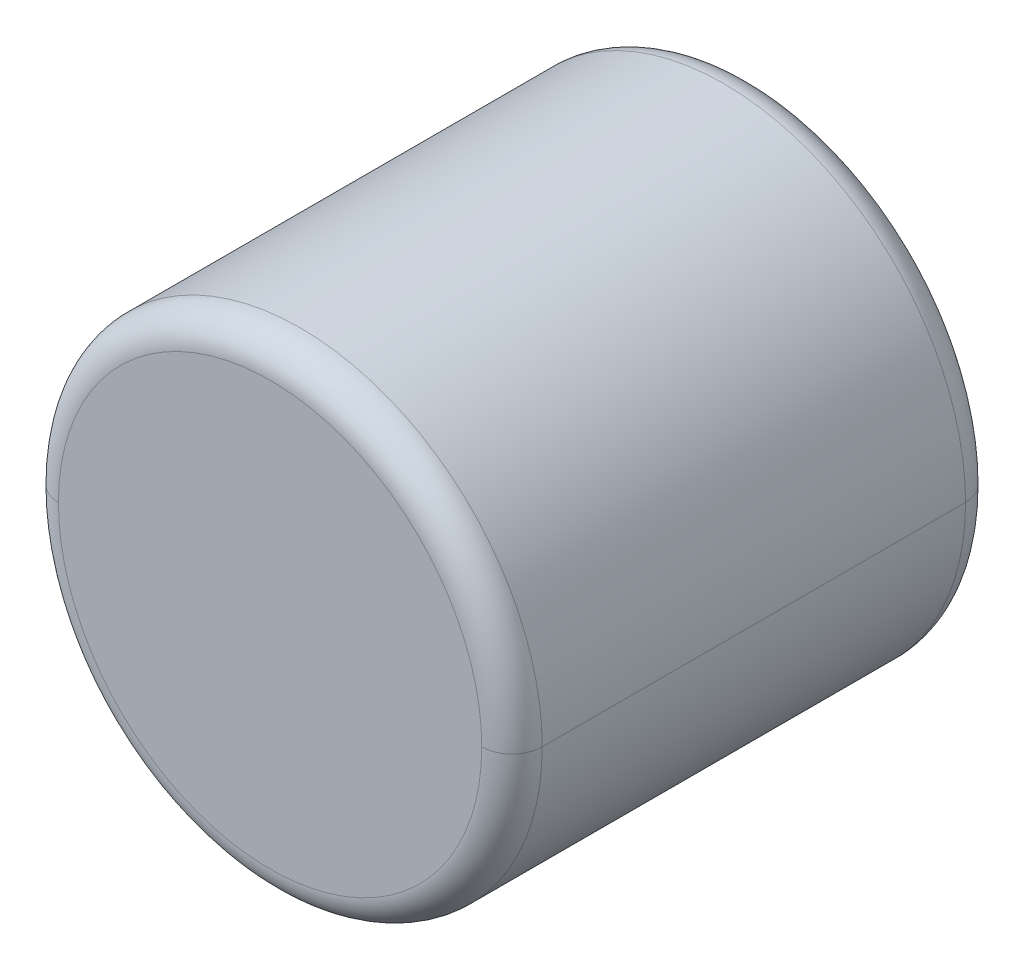
ISO-10303-21;
HEADER;
FILE_DESCRIPTION(('STEP AP214'),'2;1');
FILE_NAME('part.step','',(''),(''),'','','');
FILE_SCHEMA(('AUTOMOTIVE_DESIGN { 1 0 10303 214 1 1 1 1 }'));
ENDSEC;
DATA;
#1=APPLICATION_CONTEXT('core data for automotive mechanical design processes');
#2=APPLICATION_PROTOCOL_DEFINITION('international standard','automotive_design',2000,#1);
#3=PRODUCT_CONTEXT('',#1,'mechanical');
#4=PRODUCT('Part','Part','',(#3));
#5=PRODUCT_RELATED_PRODUCT_CATEGORY('part','',(#4));
#6=PRODUCT_DEFINITION_FORMATION('','',#4);
#7=PRODUCT_DEFINITION_CONTEXT('part definition',#1,'design');
#8=PRODUCT_DEFINITION('design','',#6,#7);
#9=PRODUCT_DEFINITION_SHAPE('','',#8);
#10=(LENGTH_UNIT() NAMED_UNIT(*) SI_UNIT(.MILLI.,.METRE.));
#11=(NAMED_UNIT(*) PLANE_ANGLE_UNIT() SI_UNIT($,.RADIAN.));
#12=(NAMED_UNIT(*) SI_UNIT($,.STERADIAN.) SOLID_ANGLE_UNIT());
#13=UNCERTAINTY_MEASURE_WITH_UNIT(LENGTH_MEASURE(1.E-05),#10,'distance_accuracy_value','');
#14=(GEOMETRIC_REPRESENTATION_CONTEXT(3) GLOBAL_UNCERTAINTY_ASSIGNED_CONTEXT((#13)) GLOBAL_UNIT_ASSIGNED_CONTEXT((#10,
#11,#12)) REPRESENTATION_CONTEXT('',''));
#15=CARTESIAN_POINT('',(0.,0.,0.));
#16=DIRECTION('',(0.,0.,1.));
#17=DIRECTION('',(1.,0.,0.));
#18=AXIS2_PLACEMENT_3D('',#15,#16,#17);
#19=CARTESIAN_POINT('',(0.,0.,-0.8));
#20=DIRECTION('',(0.,0.,1.));
#21=DIRECTION('',(1.,0.,0.));
#22=AXIS2_PLACEMENT_3D('',#19,#20,#21);
#23=CYLINDRICAL_SURFACE('',#22,0.8);
#24=DIRECTION('',(0.,0.,1.));
#25=VECTOR('',#24,1.);
#26=CARTESIAN_POINT('',(-0.8,0.,-0.7));
#27=LINE('',#26,#25);
#28=CARTESIAN_POINT('',(-0.8,0.,-0.7));
#29=VERTEX_POINT('',#28);
#30=CARTESIAN_POINT('',(-0.8,0.,0.7));
#31=VERTEX_POINT('',#30);
#32=EDGE_CURVE('E65',#29,#31,#27,.T.);
#33=ORIENTED_EDGE('',*,*,#32,.F.);
#34=CARTESIAN_POINT('',(0.,0.,-0.7));
#35=DIRECTION('',(0.,0.,-1.));
#36=DIRECTION('',(1.,0.,0.));
#37=AXIS2_PLACEMENT_3D('',#34,#35,#36);
#38=CIRCLE('',#37,0.8);
#39=CARTESIAN_POINT('',(0.8,0.,-0.7));
#40=VERTEX_POINT('',#39);
#41=EDGE_CURVE('E110',#40,#29,#38,.T.);
#42=ORIENTED_EDGE('',*,*,#41,.F.);
#43=DIRECTION('',(0.,0.,1.));
#44=VECTOR('',#43,1.);
#45=CARTESIAN_POINT('',(0.8,0.,-0.7));
#46=LINE('',#45,#44);
#47=CARTESIAN_POINT('',(0.8,0.,0.7));
#48=VERTEX_POINT('',#47);
#49=EDGE_CURVE('E67',#40,#48,#46,.T.);
#50=ORIENTED_EDGE('',*,*,#49,.T.);
#51=CARTESIAN_POINT('',(0.,0.,0.7));
#52=DIRECTION('',(0.,0.,1.));
#53=DIRECTION('',(-1.,0.,0.));
#54=AXIS2_PLACEMENT_3D('',#51,#52,#53);
#55=CIRCLE('',#54,0.8);
#56=EDGE_CURVE('E11',#31,#48,#55,.T.);
#57=ORIENTED_EDGE('',*,*,#56,.F.);
#58=EDGE_LOOP('',(#33,#42,#50,#57));
#59=FACE_BOUND('',#58,.T.);
#60=ADVANCED_FACE('F16',(#59),#23,.T.);
#61=CARTESIAN_POINT('',(0.,0.,0.7));
#62=DIRECTION('',(0.,0.,1.));
#63=DIRECTION('',(-0.999999901488725,0.000443872210789212,0.));
#64=AXIS2_PLACEMENT_3D('',#61,#62,#63);
#65=TOROIDAL_SURFACE('',#64,0.7,0.1);
#66=CARTESIAN_POINT('',(-0.7,0.,0.7));
#67=DIRECTION('',(0.,-1.,0.));
#68=DIRECTION('',(0.,0.,1.));
#69=AXIS2_PLACEMENT_3D('',#66,#67,#68);
#70=CIRCLE('',#69,0.1);
#71=CARTESIAN_POINT('',(-0.7,0.,0.8));
#72=VERTEX_POINT('',#71);
#73=EDGE_CURVE('E70',#72,#31,#70,.T.);
#74=ORIENTED_EDGE('',*,*,#73,.T.);
#75=ORIENTED_EDGE('',*,*,#56,.T.);
#76=CARTESIAN_POINT('',(0.7,0.,0.7));
#77=DIRECTION('',(0.,1.,0.));
#78=DIRECTION('',(0.,0.,1.));
#79=AXIS2_PLACEMENT_3D('',#76,#77,#78);
#80=CIRCLE('',#79,0.1);
#81=CARTESIAN_POINT('',(0.7,0.,0.8));
#82=VERTEX_POINT('',#81);
#83=EDGE_CURVE('E77',#82,#48,#80,.T.);
#84=ORIENTED_EDGE('',*,*,#83,.F.);
#85=CARTESIAN_POINT('',(0.,0.,0.8));
#86=DIRECTION('',(0.,0.,1.));
#87=DIRECTION('',(-1.,0.,0.));
#88=AXIS2_PLACEMENT_3D('',#85,#86,#87);
#89=CIRCLE('',#88,0.7);
#90=EDGE_CURVE('E26',#72,#82,#89,.T.);
#91=ORIENTED_EDGE('',*,*,#90,.F.);
#92=EDGE_LOOP('',(#74,#75,#84,#91));
#93=FACE_BOUND('',#92,.T.);
#94=ADVANCED_FACE('F72',(#93),#65,.T.);
#95=CARTESIAN_POINT('',(0.,0.,0.8));
#96=DIRECTION('',(0.,0.,1.));
#97=DIRECTION('',(1.,0.,0.));
#98=AXIS2_PLACEMENT_3D('',#95,#96,#97);
#99=PLANE('',#98);
#100=CARTESIAN_POINT('',(0.,0.,0.8));
#101=DIRECTION('',(0.,0.,1.));
#102=DIRECTION('',(1.,0.,0.));
#103=AXIS2_PLACEMENT_3D('',#100,#101,#102);
#104=CIRCLE('',#103,0.7);
#105=EDGE_CURVE('E76',#82,#72,#104,.T.);
#106=ORIENTED_EDGE('',*,*,#105,.T.);
#107=ORIENTED_EDGE('',*,*,#90,.T.);
#108=EDGE_LOOP('',(#106,#107));
#109=FACE_BOUND('',#108,.T.);
#110=ADVANCED_FACE('F135',(#109),#99,.T.);
#111=CARTESIAN_POINT('',(0.,0.,0.7));
#112=DIRECTION('',(0.,0.,1.));
#113=DIRECTION('',(0.999999901488725,-0.000443872210789012,0.));
#114=AXIS2_PLACEMENT_3D('',#111,#112,#113);
#115=TOROIDAL_SURFACE('',#114,0.7,0.1);
#116=ORIENTED_EDGE('',*,*,#83,.T.);
#117=CARTESIAN_POINT('',(0.,0.,0.7));
#118=DIRECTION('',(0.,0.,1.));
#119=DIRECTION('',(1.,0.,0.));
#120=AXIS2_PLACEMENT_3D('',#117,#118,#119);
#121=CIRCLE('',#120,0.8);
#122=EDGE_CURVE('E80',#48,#31,#121,.T.);
#123=ORIENTED_EDGE('',*,*,#122,.T.);
#124=ORIENTED_EDGE('',*,*,#73,.F.);
#125=ORIENTED_EDGE('',*,*,#105,.F.);
#126=EDGE_LOOP('',(#116,#123,#124,#125));
#127=FACE_BOUND('',#126,.T.);
#128=ADVANCED_FACE('F81',(#127),#115,.T.);
#129=CARTESIAN_POINT('',(0.,0.,-0.8));
#130=DIRECTION('',(0.,0.,1.));
#131=DIRECTION('',(1.,0.,0.));
#132=AXIS2_PLACEMENT_3D('',#129,#130,#131);
#133=CYLINDRICAL_SURFACE('',#132,0.8);
#134=ORIENTED_EDGE('',*,*,#49,.F.);
#135=CARTESIAN_POINT('',(0.,0.,-0.7));
#136=DIRECTION('',(0.,0.,-1.));
#137=DIRECTION('',(-1.,0.,0.));
#138=AXIS2_PLACEMENT_3D('',#135,#136,#137);
#139=CIRCLE('',#138,0.8);
#140=EDGE_CURVE('E87',#29,#40,#139,.T.);
#141=ORIENTED_EDGE('',*,*,#140,.F.);
#142=ORIENTED_EDGE('',*,*,#32,.T.);
#143=ORIENTED_EDGE('',*,*,#122,.F.);
#144=EDGE_LOOP('',(#134,#141,#142,#143));
#145=FACE_BOUND('',#144,.T.);
#146=ADVANCED_FACE('F85',(#145),#133,.T.);
#147=CARTESIAN_POINT('',(0.,0.,-0.7));
#148=DIRECTION('',(0.,0.,1.));
#149=DIRECTION('',(-0.999999801206386,-0.000630545152403891,0.));
#150=AXIS2_PLACEMENT_3D('',#147,#148,#149);
#151=TOROIDAL_SURFACE('',#150,0.7,0.1);
#152=CARTESIAN_POINT('',(-0.7,0.,-0.7));
#153=DIRECTION('',(0.,1.,0.));
#154=DIRECTION('',(0.,0.,-1.));
#155=AXIS2_PLACEMENT_3D('',#152,#153,#154);
#156=CIRCLE('',#155,0.1);
#157=CARTESIAN_POINT('',(-0.7,0.,-0.8));
#158=VERTEX_POINT('',#157);
#159=EDGE_CURVE('E96',#158,#29,#156,.T.);
#160=ORIENTED_EDGE('',*,*,#159,.T.);
#161=ORIENTED_EDGE('',*,*,#140,.T.);
#162=CARTESIAN_POINT('',(0.7,0.,-0.7));
#163=DIRECTION('',(0.,-1.,0.));
#164=DIRECTION('',(0.,0.,-1.));
#165=AXIS2_PLACEMENT_3D('',#162,#163,#164);
#166=CIRCLE('',#165,0.1);
#167=CARTESIAN_POINT('',(0.7,0.,-0.8));
#168=VERTEX_POINT('',#167);
#169=EDGE_CURVE('E101',#168,#40,#166,.T.);
#170=ORIENTED_EDGE('',*,*,#169,.F.);
#171=CARTESIAN_POINT('',(0.,0.,-0.8));
#172=DIRECTION('',(0.,0.,-1.));
#173=DIRECTION('',(-1.,0.,0.));
#174=AXIS2_PLACEMENT_3D('',#171,#172,#173);
#175=CIRCLE('',#174,0.7);
#176=EDGE_CURVE('E102',#158,#168,#175,.T.);
#177=ORIENTED_EDGE('',*,*,#176,.F.);
#178=EDGE_LOOP('',(#160,#161,#170,#177));
#179=FACE_BOUND('',#178,.T.);
#180=ADVANCED_FACE('F18',(#179),#151,.T.);
#181=CARTESIAN_POINT('',(0.,0.,-0.7));
#182=DIRECTION('',(0.,0.,1.));
#183=DIRECTION('',(0.999999801206386,0.000630545152403791,0.));
#184=AXIS2_PLACEMENT_3D('',#181,#182,#183);
#185=TOROIDAL_SURFACE('',#184,0.7,0.1);
#186=ORIENTED_EDGE('',*,*,#169,.T.);
#187=ORIENTED_EDGE('',*,*,#41,.T.);
#188=ORIENTED_EDGE('',*,*,#159,.F.);
#189=CARTESIAN_POINT('',(0.,0.,-0.8));
#190=DIRECTION('',(0.,0.,-1.));
#191=DIRECTION('',(1.,0.,0.));
#192=AXIS2_PLACEMENT_3D('',#189,#190,#191);
#193=CIRCLE('',#192,0.7);
#194=EDGE_CURVE('E97',#168,#158,#193,.T.);
#195=ORIENTED_EDGE('',*,*,#194,.F.);
#196=EDGE_LOOP('',(#186,#187,#188,#195));
#197=FACE_BOUND('',#196,.T.);
#198=ADVANCED_FACE('F153',(#197),#185,.T.);
#199=CARTESIAN_POINT('',(0.,0.,-0.8));
#200=DIRECTION('',(0.,0.,1.));
#201=DIRECTION('',(1.,0.,0.));
#202=AXIS2_PLACEMENT_3D('',#199,#200,#201);
#203=PLANE('',#202);
#204=ORIENTED_EDGE('',*,*,#176,.T.);
#205=ORIENTED_EDGE('',*,*,#194,.T.);
#206=EDGE_LOOP('',(#204,#205));
#207=FACE_BOUND('',#206,.T.);
#208=ADVANCED_FACE('F150',(#207),#203,.F.);
#209=CLOSED_SHELL('',(#60,#94,#110,#128,#146,#180,#198,#208));
#210=MANIFOLD_SOLID_BREP('B1',#209);
#211=ADVANCED_BREP_SHAPE_REPRESENTATION('',(#18,#210),#14);
#212=SHAPE_DEFINITION_REPRESENTATION(#9,#211);
ENDSEC;
END-ISO-10303-21;
